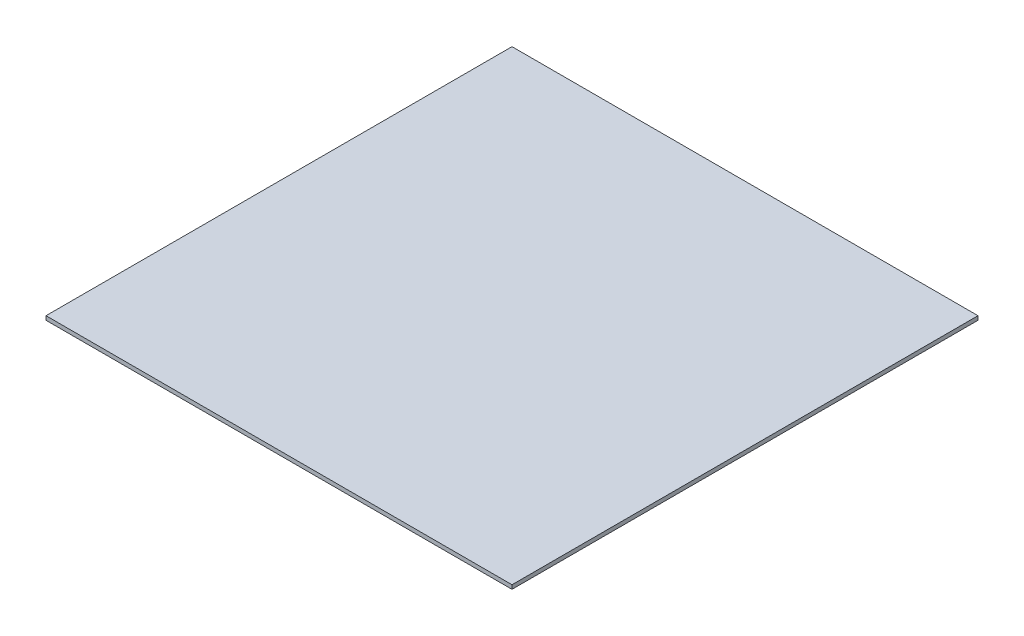
ISO-10303-21;
HEADER;
FILE_DESCRIPTION(('STEP AP214'),'2;1');
FILE_NAME('part.step','',(''),(''),'','','');
FILE_SCHEMA(('AUTOMOTIVE_DESIGN { 1 0 10303 214 1 1 1 1 }'));
ENDSEC;
DATA;
#1=APPLICATION_CONTEXT('core data for automotive mechanical design processes');
#2=APPLICATION_PROTOCOL_DEFINITION('international standard','automotive_design',2000,#1);
#3=PRODUCT_CONTEXT('',#1,'mechanical');
#4=PRODUCT('Part','Part','',(#3));
#5=PRODUCT_RELATED_PRODUCT_CATEGORY('part','',(#4));
#6=PRODUCT_DEFINITION_FORMATION('','',#4);
#7=PRODUCT_DEFINITION_CONTEXT('part definition',#1,'design');
#8=PRODUCT_DEFINITION('design','',#6,#7);
#9=PRODUCT_DEFINITION_SHAPE('','',#8);
#10=(LENGTH_UNIT() NAMED_UNIT(*) SI_UNIT(.MILLI.,.METRE.));
#11=(NAMED_UNIT(*) PLANE_ANGLE_UNIT() SI_UNIT($,.RADIAN.));
#12=(NAMED_UNIT(*) SI_UNIT($,.STERADIAN.) SOLID_ANGLE_UNIT());
#13=UNCERTAINTY_MEASURE_WITH_UNIT(LENGTH_MEASURE(1.E-05),#10,'distance_accuracy_value','');
#14=(GEOMETRIC_REPRESENTATION_CONTEXT(3) GLOBAL_UNCERTAINTY_ASSIGNED_CONTEXT((#13)) GLOBAL_UNIT_ASSIGNED_CONTEXT((#10,
#11,#12)) REPRESENTATION_CONTEXT('',''));
#15=CARTESIAN_POINT('',(0.,0.,0.));
#16=DIRECTION('',(0.,0.,1.));
#17=DIRECTION('',(1.,0.,0.));
#18=AXIS2_PLACEMENT_3D('',#15,#16,#17);
#19=CARTESIAN_POINT('',(175.,3.,175.));
#20=DIRECTION('',(-1.,0.,0.));
#21=DIRECTION('',(0.,0.,1.));
#22=AXIS2_PLACEMENT_3D('',#19,#20,#21);
#23=PLANE('',#22);
#24=DIRECTION('',(0.,0.,-1.));
#25=VECTOR('',#24,1.);
#26=CARTESIAN_POINT('',(175.,0.,175.));
#27=LINE('',#26,#25);
#28=CARTESIAN_POINT('',(175.,0.,175.));
#29=VERTEX_POINT('',#28);
#30=CARTESIAN_POINT('',(175.,0.,-175.));
#31=VERTEX_POINT('',#30);
#32=EDGE_CURVE('E98',#29,#31,#27,.T.);
#33=ORIENTED_EDGE('',*,*,#32,.T.);
#34=DIRECTION('',(0.,-1.,0.));
#35=VECTOR('',#34,1.);
#36=CARTESIAN_POINT('',(175.,3.,-175.));
#37=LINE('',#36,#35);
#38=CARTESIAN_POINT('',(175.,3.,-175.));
#39=VERTEX_POINT('',#38);
#40=EDGE_CURVE('E11',#39,#31,#37,.T.);
#41=ORIENTED_EDGE('',*,*,#40,.F.);
#42=DIRECTION('',(0.,0.,-1.));
#43=VECTOR('',#42,1.);
#44=CARTESIAN_POINT('',(175.,3.,175.));
#45=LINE('',#44,#43);
#46=CARTESIAN_POINT('',(175.,3.,175.));
#47=VERTEX_POINT('',#46);
#48=EDGE_CURVE('E86',#47,#39,#45,.T.);
#49=ORIENTED_EDGE('',*,*,#48,.F.);
#50=DIRECTION('',(0.,-1.,0.));
#51=VECTOR('',#50,1.);
#52=CARTESIAN_POINT('',(175.,3.,175.));
#53=LINE('',#52,#51);
#54=EDGE_CURVE('E94',#47,#29,#53,.T.);
#55=ORIENTED_EDGE('',*,*,#54,.T.);
#56=EDGE_LOOP('',(#33,#41,#49,#55));
#57=FACE_BOUND('',#56,.T.);
#58=ADVANCED_FACE('F35',(#57),#23,.F.);
#59=CARTESIAN_POINT('',(-175.,3.,-175.));
#60=DIRECTION('',(0.,0.,1.));
#61=DIRECTION('',(1.,0.,0.));
#62=AXIS2_PLACEMENT_3D('',#59,#60,#61);
#63=PLANE('',#62);
#64=DIRECTION('',(-1.,0.,0.));
#65=VECTOR('',#64,1.);
#66=CARTESIAN_POINT('',(-175.,0.,-175.));
#67=LINE('',#66,#65);
#68=CARTESIAN_POINT('',(-175.,0.,-175.));
#69=VERTEX_POINT('',#68);
#70=EDGE_CURVE('E90',#31,#69,#67,.T.);
#71=ORIENTED_EDGE('',*,*,#70,.T.);
#72=DIRECTION('',(0.,-1.,0.));
#73=VECTOR('',#72,1.);
#74=CARTESIAN_POINT('',(-175.,3.,-175.));
#75=LINE('',#74,#73);
#76=CARTESIAN_POINT('',(-175.,3.,-175.));
#77=VERTEX_POINT('',#76);
#78=EDGE_CURVE('E43',#77,#69,#75,.T.);
#79=ORIENTED_EDGE('',*,*,#78,.F.);
#80=DIRECTION('',(-1.,0.,0.));
#81=VECTOR('',#80,1.);
#82=CARTESIAN_POINT('',(-175.,3.,-175.));
#83=LINE('',#82,#81);
#84=EDGE_CURVE('E81',#39,#77,#83,.T.);
#85=ORIENTED_EDGE('',*,*,#84,.F.);
#86=ORIENTED_EDGE('',*,*,#40,.T.);
#87=EDGE_LOOP('',(#71,#79,#85,#86));
#88=FACE_BOUND('',#87,.T.);
#89=ADVANCED_FACE('F89',(#88),#63,.F.);
#90=CARTESIAN_POINT('',(-175.,3.,175.));
#91=DIRECTION('',(1.,0.,0.));
#92=DIRECTION('',(0.,0.,-1.));
#93=AXIS2_PLACEMENT_3D('',#90,#91,#92);
#94=PLANE('',#93);
#95=DIRECTION('',(0.,0.,1.));
#96=VECTOR('',#95,1.);
#97=CARTESIAN_POINT('',(-175.,0.,175.));
#98=LINE('',#97,#96);
#99=CARTESIAN_POINT('',(-175.,0.,175.));
#100=VERTEX_POINT('',#99);
#101=EDGE_CURVE('E68',#69,#100,#98,.T.);
#102=ORIENTED_EDGE('',*,*,#101,.T.);
#103=DIRECTION('',(0.,-1.,0.));
#104=VECTOR('',#103,1.);
#105=CARTESIAN_POINT('',(-175.,3.,175.));
#106=LINE('',#105,#104);
#107=CARTESIAN_POINT('',(-175.,3.,175.));
#108=VERTEX_POINT('',#107);
#109=EDGE_CURVE('E91',#108,#100,#106,.T.);
#110=ORIENTED_EDGE('',*,*,#109,.F.);
#111=DIRECTION('',(0.,0.,1.));
#112=VECTOR('',#111,1.);
#113=CARTESIAN_POINT('',(-175.,3.,175.));
#114=LINE('',#113,#112);
#115=EDGE_CURVE('E84',#77,#108,#114,.T.);
#116=ORIENTED_EDGE('',*,*,#115,.F.);
#117=ORIENTED_EDGE('',*,*,#78,.T.);
#118=EDGE_LOOP('',(#102,#110,#116,#117));
#119=FACE_BOUND('',#118,.T.);
#120=ADVANCED_FACE('F92',(#119),#94,.F.);
#121=CARTESIAN_POINT('',(-175.,3.,175.));
#122=DIRECTION('',(0.,0.,-1.));
#123=DIRECTION('',(-1.,0.,0.));
#124=AXIS2_PLACEMENT_3D('',#121,#122,#123);
#125=PLANE('',#124);
#126=DIRECTION('',(1.,0.,0.));
#127=VECTOR('',#126,1.);
#128=CARTESIAN_POINT('',(-175.,0.,175.));
#129=LINE('',#128,#127);
#130=EDGE_CURVE('E74',#100,#29,#129,.T.);
#131=ORIENTED_EDGE('',*,*,#130,.T.);
#132=ORIENTED_EDGE('',*,*,#54,.F.);
#133=DIRECTION('',(1.,0.,0.));
#134=VECTOR('',#133,1.);
#135=CARTESIAN_POINT('',(-175.,3.,175.));
#136=LINE('',#135,#134);
#137=EDGE_CURVE('E51',#108,#47,#136,.T.);
#138=ORIENTED_EDGE('',*,*,#137,.F.);
#139=ORIENTED_EDGE('',*,*,#109,.T.);
#140=EDGE_LOOP('',(#131,#132,#138,#139));
#141=FACE_BOUND('',#140,.T.);
#142=ADVANCED_FACE('F105',(#141),#125,.F.);
#143=CARTESIAN_POINT('',(0.,3.,0.));
#144=DIRECTION('',(0.,-1.,0.));
#145=DIRECTION('',(0.,0.,-1.));
#146=AXIS2_PLACEMENT_3D('',#143,#144,#145);
#147=PLANE('',#146);
#148=ORIENTED_EDGE('',*,*,#48,.T.);
#149=ORIENTED_EDGE('',*,*,#84,.T.);
#150=ORIENTED_EDGE('',*,*,#115,.T.);
#151=ORIENTED_EDGE('',*,*,#137,.T.);
#152=EDGE_LOOP('',(#148,#149,#150,#151));
#153=FACE_BOUND('',#152,.T.);
#154=ADVANCED_FACE('F82',(#153),#147,.F.);
#155=CARTESIAN_POINT('',(0.,0.,0.));
#156=DIRECTION('',(0.,-1.,0.));
#157=DIRECTION('',(0.,0.,-1.));
#158=AXIS2_PLACEMENT_3D('',#155,#156,#157);
#159=PLANE('',#158);
#160=ORIENTED_EDGE('',*,*,#32,.F.);
#161=ORIENTED_EDGE('',*,*,#130,.F.);
#162=ORIENTED_EDGE('',*,*,#101,.F.);
#163=ORIENTED_EDGE('',*,*,#70,.F.);
#164=EDGE_LOOP('',(#160,#161,#162,#163));
#165=FACE_BOUND('',#164,.T.);
#166=ADVANCED_FACE('F108',(#165),#159,.T.);
#167=CLOSED_SHELL('',(#58,#89,#120,#142,#154,#166));
#168=MANIFOLD_SOLID_BREP('B2',#167);
#169=ADVANCED_BREP_SHAPE_REPRESENTATION('',(#18,#168),#14);
#170=SHAPE_DEFINITION_REPRESENTATION(#9,#169);
ENDSEC;
END-ISO-10303-21;
